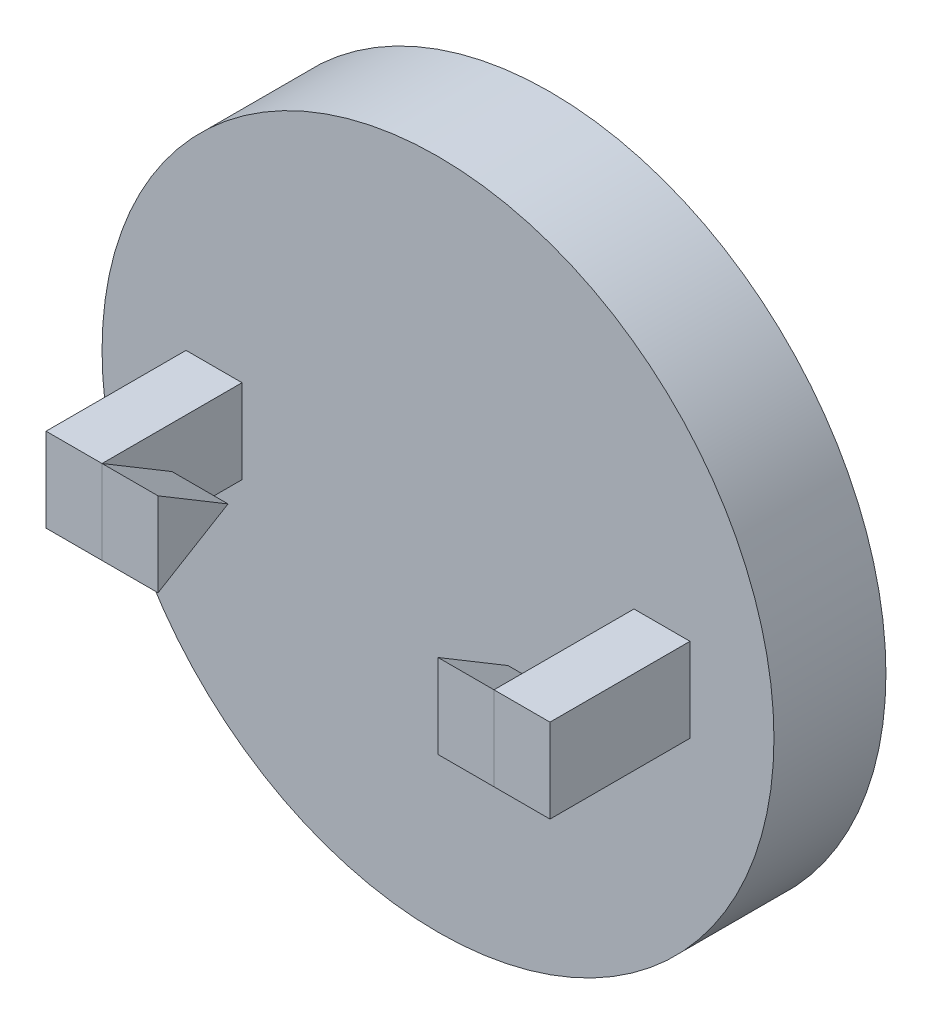
ISO-10303-21;
HEADER;
FILE_DESCRIPTION(('STEP AP214'),'2;1');
FILE_NAME('part.step','',(''),(''),'','','');
FILE_SCHEMA(('AUTOMOTIVE_DESIGN { 1 0 10303 214 1 1 1 1 }'));
ENDSEC;
DATA;
#1=APPLICATION_CONTEXT('core data for automotive mechanical design processes');
#2=APPLICATION_PROTOCOL_DEFINITION('international standard','automotive_design',2000,#1);
#3=PRODUCT_CONTEXT('',#1,'mechanical');
#4=PRODUCT('Part','Part','',(#3));
#5=PRODUCT_RELATED_PRODUCT_CATEGORY('part','',(#4));
#6=PRODUCT_DEFINITION_FORMATION('','',#4);
#7=PRODUCT_DEFINITION_CONTEXT('part definition',#1,'design');
#8=PRODUCT_DEFINITION('design','',#6,#7);
#9=PRODUCT_DEFINITION_SHAPE('','',#8);
#10=(LENGTH_UNIT() NAMED_UNIT(*) SI_UNIT(.MILLI.,.METRE.));
#11=(NAMED_UNIT(*) PLANE_ANGLE_UNIT() SI_UNIT($,.RADIAN.));
#12=(NAMED_UNIT(*) SI_UNIT($,.STERADIAN.) SOLID_ANGLE_UNIT());
#13=UNCERTAINTY_MEASURE_WITH_UNIT(LENGTH_MEASURE(1.E-05),#10,'distance_accuracy_value','');
#14=(GEOMETRIC_REPRESENTATION_CONTEXT(3) GLOBAL_UNCERTAINTY_ASSIGNED_CONTEXT((#13)) GLOBAL_UNIT_ASSIGNED_CONTEXT((#10,
#11,#12)) REPRESENTATION_CONTEXT('',''));
#15=CARTESIAN_POINT('',(0.,0.,0.));
#16=DIRECTION('',(0.,0.,1.));
#17=DIRECTION('',(1.,0.,0.));
#18=AXIS2_PLACEMENT_3D('',#15,#16,#17);
#19=CARTESIAN_POINT('',(35.,7.5,35.));
#20=DIRECTION('',(1.,0.,0.));
#21=DIRECTION('',(0.,0.,1.));
#22=AXIS2_PLACEMENT_3D('',#19,#20,#21);
#23=PLANE('',#22);
#24=DIRECTION('',(0.,1.,0.));
#25=VECTOR('',#24,1.);
#26=CARTESIAN_POINT('',(35.,7.5,10.));
#27=LINE('',#26,#25);
#28=CARTESIAN_POINT('',(35.,-7.5,10.));
#29=VERTEX_POINT('',#28);
#30=CARTESIAN_POINT('',(35.,7.5,10.));
#31=VERTEX_POINT('',#30);
#32=EDGE_CURVE('E117',#29,#31,#27,.T.);
#33=ORIENTED_EDGE('',*,*,#32,.F.);
#34=DIRECTION('',(0.,0.,-1.));
#35=VECTOR('',#34,1.);
#36=CARTESIAN_POINT('',(35.,-7.5,35.));
#37=LINE('',#36,#35);
#38=CARTESIAN_POINT('',(35.,-7.5,35.));
#39=VERTEX_POINT('',#38);
#40=EDGE_CURVE('E116',#39,#29,#37,.T.);
#41=ORIENTED_EDGE('',*,*,#40,.F.);
#42=DIRECTION('',(0.,1.,0.));
#43=VECTOR('',#42,1.);
#44=CARTESIAN_POINT('',(35.,7.5,35.));
#45=LINE('',#44,#43);
#46=CARTESIAN_POINT('',(35.,7.5,35.));
#47=VERTEX_POINT('',#46);
#48=EDGE_CURVE('E111',#39,#47,#45,.T.);
#49=ORIENTED_EDGE('',*,*,#48,.T.);
#50=DIRECTION('',(0.,0.,-1.));
#51=VECTOR('',#50,1.);
#52=CARTESIAN_POINT('',(35.,7.5,35.));
#53=LINE('',#52,#51);
#54=EDGE_CURVE('E12',#47,#31,#53,.T.);
#55=ORIENTED_EDGE('',*,*,#54,.T.);
#56=EDGE_LOOP('',(#33,#41,#49,#55));
#57=FACE_BOUND('',#56,.T.);
#58=ADVANCED_FACE('F54',(#57),#23,.F.);
#59=CARTESIAN_POINT('',(45.,7.5,35.));
#60=DIRECTION('',(0.,-1.,0.));
#61=DIRECTION('',(0.,0.,-1.));
#62=AXIS2_PLACEMENT_3D('',#59,#60,#61);
#63=PLANE('',#62);
#64=DIRECTION('',(1.,0.,0.));
#65=VECTOR('',#64,1.);
#66=CARTESIAN_POINT('',(45.,7.5,10.));
#67=LINE('',#66,#65);
#68=CARTESIAN_POINT('',(45.,7.5,10.));
#69=VERTEX_POINT('',#68);
#70=EDGE_CURVE('E119',#31,#69,#67,.T.);
#71=ORIENTED_EDGE('',*,*,#70,.F.);
#72=ORIENTED_EDGE('',*,*,#54,.F.);
#73=DIRECTION('',(1.,0.,0.));
#74=VECTOR('',#73,1.);
#75=CARTESIAN_POINT('',(45.,7.5,35.));
#76=LINE('',#75,#74);
#77=CARTESIAN_POINT('',(45.,7.5,35.));
#78=VERTEX_POINT('',#77);
#79=EDGE_CURVE('E95',#47,#78,#76,.T.);
#80=ORIENTED_EDGE('',*,*,#79,.T.);
#81=DIRECTION('',(0.,0.,-1.));
#82=VECTOR('',#81,1.);
#83=CARTESIAN_POINT('',(45.,7.5,35.));
#84=LINE('',#83,#82);
#85=EDGE_CURVE('E62',#78,#69,#84,.T.);
#86=ORIENTED_EDGE('',*,*,#85,.T.);
#87=EDGE_LOOP('',(#71,#72,#80,#86));
#88=FACE_BOUND('',#87,.T.);
#89=ADVANCED_FACE('F109',(#88),#63,.F.);
#90=CARTESIAN_POINT('',(45.,7.5,35.));
#91=DIRECTION('',(-1.,0.,0.));
#92=DIRECTION('',(0.,0.,-1.));
#93=AXIS2_PLACEMENT_3D('',#90,#91,#92);
#94=PLANE('',#93);
#95=DIRECTION('',(0.,-1.,0.));
#96=VECTOR('',#95,1.);
#97=CARTESIAN_POINT('',(45.,7.5,10.));
#98=LINE('',#97,#96);
#99=CARTESIAN_POINT('',(45.,-7.5,10.));
#100=VERTEX_POINT('',#99);
#101=EDGE_CURVE('E105',#69,#100,#98,.T.);
#102=ORIENTED_EDGE('',*,*,#101,.F.);
#103=ORIENTED_EDGE('',*,*,#85,.F.);
#104=DIRECTION('',(0.,-1.,0.));
#105=VECTOR('',#104,1.);
#106=CARTESIAN_POINT('',(45.,7.5,35.));
#107=LINE('',#106,#105);
#108=CARTESIAN_POINT('',(45.,-7.5,35.));
#109=VERTEX_POINT('',#108);
#110=EDGE_CURVE('E98',#78,#109,#107,.T.);
#111=ORIENTED_EDGE('',*,*,#110,.T.);
#112=DIRECTION('',(0.,0.,-1.));
#113=VECTOR('',#112,1.);
#114=CARTESIAN_POINT('',(45.,-7.5,35.));
#115=LINE('',#114,#113);
#116=EDGE_CURVE('E108',#109,#100,#115,.T.);
#117=ORIENTED_EDGE('',*,*,#116,.T.);
#118=EDGE_LOOP('',(#102,#103,#111,#117));
#119=FACE_BOUND('',#118,.T.);
#120=ADVANCED_FACE('F104',(#119),#94,.F.);
#121=CARTESIAN_POINT('',(45.,-7.5,35.));
#122=DIRECTION('',(0.,1.,0.));
#123=DIRECTION('',(1.,0.,0.));
#124=AXIS2_PLACEMENT_3D('',#121,#122,#123);
#125=PLANE('',#124);
#126=DIRECTION('',(-1.,0.,0.));
#127=VECTOR('',#126,1.);
#128=CARTESIAN_POINT('',(45.,-7.5,10.));
#129=LINE('',#128,#127);
#130=EDGE_CURVE('E84',#100,#29,#129,.T.);
#131=ORIENTED_EDGE('',*,*,#130,.F.);
#132=ORIENTED_EDGE('',*,*,#116,.F.);
#133=DIRECTION('',(-1.,0.,0.));
#134=VECTOR('',#133,1.);
#135=CARTESIAN_POINT('',(45.,-7.5,35.));
#136=LINE('',#135,#134);
#137=EDGE_CURVE('E70',#109,#39,#136,.T.);
#138=ORIENTED_EDGE('',*,*,#137,.T.);
#139=ORIENTED_EDGE('',*,*,#40,.T.);
#140=EDGE_LOOP('',(#131,#132,#138,#139));
#141=FACE_BOUND('',#140,.T.);
#142=ADVANCED_FACE('F128',(#141),#125,.F.);
#143=CARTESIAN_POINT('',(0.,0.,35.));
#144=DIRECTION('',(0.,0.,1.));
#145=DIRECTION('',(-1.,0.,0.));
#146=AXIS2_PLACEMENT_3D('',#143,#144,#145);
#147=PLANE('',#146);
#148=ORIENTED_EDGE('',*,*,#48,.F.);
#149=ORIENTED_EDGE('',*,*,#137,.F.);
#150=ORIENTED_EDGE('',*,*,#110,.F.);
#151=ORIENTED_EDGE('',*,*,#79,.F.);
#152=EDGE_LOOP('',(#148,#149,#150,#151));
#153=FACE_BOUND('',#152,.T.);
#154=ADVANCED_FACE('F100',(#153),#147,.T.);
#155=CARTESIAN_POINT('',(0.,0.,10.));
#156=DIRECTION('',(0.,0.,1.));
#157=DIRECTION('',(-1.,0.,0.));
#158=AXIS2_PLACEMENT_3D('',#155,#156,#157);
#159=PLANE('',#158);
#160=ORIENTED_EDGE('',*,*,#32,.T.);
#161=ORIENTED_EDGE('',*,*,#70,.T.);
#162=ORIENTED_EDGE('',*,*,#101,.T.);
#163=ORIENTED_EDGE('',*,*,#130,.T.);
#164=EDGE_LOOP('',(#160,#161,#162,#163));
#165=FACE_BOUND('',#164,.T.);
#166=ADVANCED_FACE('F124',(#165),#159,.F.);
#167=CLOSED_SHELL('',(#58,#89,#120,#142,#154,#166));
#168=MANIFOLD_SOLID_BREP('B2',#167);
#169=CARTESIAN_POINT('',(25.,-9.9264705882353,5.95588235294118));
#170=DIRECTION('',(0.,0.857492925712544,-0.514495755427526));
#171=DIRECTION('',(0.,0.514495755427527,0.857492925712544));
#172=AXIS2_PLACEMENT_3D('',#169,#170,#171);
#173=PLANE('',#172);
#174=DIRECTION('',(0.,-0.514495755427527,-0.857492925712544));
#175=VECTOR('',#174,1.);
#176=CARTESIAN_POINT('',(35.,-9.9264705882353,5.95588235294118));
#177=LINE('',#176,#175);
#178=CARTESIAN_POINT('',(35.,7.5,35.));
#179=VERTEX_POINT('',#178);
#180=CARTESIAN_POINT('',(35.,0.,22.5));
#181=VERTEX_POINT('',#180);
#182=EDGE_CURVE('E252',#179,#181,#177,.T.);
#183=ORIENTED_EDGE('',*,*,#182,.T.);
#184=DIRECTION('',(1.,0.,0.));
#185=VECTOR('',#184,1.);
#186=CARTESIAN_POINT('',(25.,0.,22.5));
#187=LINE('',#186,#185);
#188=CARTESIAN_POINT('',(25.,0.,22.5));
#189=VERTEX_POINT('',#188);
#190=EDGE_CURVE('E247',#189,#181,#187,.T.);
#191=ORIENTED_EDGE('',*,*,#190,.F.);
#192=DIRECTION('',(0.,-0.514495755427527,-0.857492925712544));
#193=VECTOR('',#192,1.);
#194=CARTESIAN_POINT('',(25.,-9.9264705882353,5.95588235294118));
#195=LINE('',#194,#193);
#196=CARTESIAN_POINT('',(25.,7.5,35.));
#197=VERTEX_POINT('',#196);
#198=EDGE_CURVE('E239',#197,#189,#195,.T.);
#199=ORIENTED_EDGE('',*,*,#198,.F.);
#200=DIRECTION('',(1.,0.,0.));
#201=VECTOR('',#200,1.);
#202=CARTESIAN_POINT('',(25.,7.5,35.));
#203=LINE('',#202,#201);
#204=EDGE_CURVE('E52',#197,#179,#203,.T.);
#205=ORIENTED_EDGE('',*,*,#204,.T.);
#206=EDGE_LOOP('',(#183,#191,#199,#205));
#207=FACE_BOUND('',#206,.T.);
#208=ADVANCED_FACE('F200',(#207),#173,.T.);
#209=CARTESIAN_POINT('',(25.,0.,35.));
#210=DIRECTION('',(0.,0.,-1.));
#211=DIRECTION('',(1.,0.,0.));
#212=AXIS2_PLACEMENT_3D('',#209,#210,#211);
#213=PLANE('',#212);
#214=DIRECTION('',(0.,-1.,0.));
#215=VECTOR('',#214,1.);
#216=CARTESIAN_POINT('',(35.,0.,35.));
#217=LINE('',#216,#215);
#218=CARTESIAN_POINT('',(35.,-7.5,35.));
#219=VERTEX_POINT('',#218);
#220=EDGE_CURVE('E244',#179,#219,#217,.T.);
#221=ORIENTED_EDGE('',*,*,#220,.F.);
#222=ORIENTED_EDGE('',*,*,#204,.F.);
#223=DIRECTION('',(0.,-1.,0.));
#224=VECTOR('',#223,1.);
#225=CARTESIAN_POINT('',(25.,0.,35.));
#226=LINE('',#225,#224);
#227=CARTESIAN_POINT('',(25.,-7.5,35.));
#228=VERTEX_POINT('',#227);
#229=EDGE_CURVE('E235',#197,#228,#226,.T.);
#230=ORIENTED_EDGE('',*,*,#229,.T.);
#231=DIRECTION('',(1.,0.,0.));
#232=VECTOR('',#231,1.);
#233=CARTESIAN_POINT('',(25.,-7.5,35.));
#234=LINE('',#233,#232);
#235=EDGE_CURVE('E208',#228,#219,#234,.T.);
#236=ORIENTED_EDGE('',*,*,#235,.T.);
#237=EDGE_LOOP('',(#221,#222,#230,#236));
#238=FACE_BOUND('',#237,.T.);
#239=ADVANCED_FACE('F243',(#238),#213,.F.);
#240=CARTESIAN_POINT('',(25.,9.9264705882353,5.95588235294118));
#241=DIRECTION('',(0.,0.857492925712544,0.514495755427526));
#242=DIRECTION('',(0.,-0.514495755427527,0.857492925712544));
#243=AXIS2_PLACEMENT_3D('',#240,#241,#242);
#244=PLANE('',#243);
#245=DIRECTION('',(0.,0.514495755427527,-0.857492925712544));
#246=VECTOR('',#245,1.);
#247=CARTESIAN_POINT('',(35.,9.9264705882353,5.95588235294118));
#248=LINE('',#247,#246);
#249=EDGE_CURVE('E227',#219,#181,#248,.T.);
#250=ORIENTED_EDGE('',*,*,#249,.F.);
#251=ORIENTED_EDGE('',*,*,#235,.F.);
#252=DIRECTION('',(0.,0.514495755427527,-0.857492925712544));
#253=VECTOR('',#252,1.);
#254=CARTESIAN_POINT('',(25.,9.9264705882353,5.95588235294118));
#255=LINE('',#254,#253);
#256=EDGE_CURVE('E216',#228,#189,#255,.T.);
#257=ORIENTED_EDGE('',*,*,#256,.T.);
#258=ORIENTED_EDGE('',*,*,#190,.T.);
#259=EDGE_LOOP('',(#250,#251,#257,#258));
#260=FACE_BOUND('',#259,.T.);
#261=ADVANCED_FACE('F261',(#260),#244,.F.);
#262=CARTESIAN_POINT('',(25.,0.,0.));
#263=DIRECTION('',(-1.,0.,0.));
#264=DIRECTION('',(0.,0.,-1.));
#265=AXIS2_PLACEMENT_3D('',#262,#263,#264);
#266=PLANE('',#265);
#267=ORIENTED_EDGE('',*,*,#198,.T.);
#268=ORIENTED_EDGE('',*,*,#256,.F.);
#269=ORIENTED_EDGE('',*,*,#229,.F.);
#270=EDGE_LOOP('',(#267,#268,#269));
#271=FACE_BOUND('',#270,.T.);
#272=ADVANCED_FACE('F237',(#271),#266,.T.);
#273=CARTESIAN_POINT('',(35.,0.,0.));
#274=DIRECTION('',(-1.,0.,0.));
#275=DIRECTION('',(0.,0.,-1.));
#276=AXIS2_PLACEMENT_3D('',#273,#274,#275);
#277=PLANE('',#276);
#278=ORIENTED_EDGE('',*,*,#182,.F.);
#279=ORIENTED_EDGE('',*,*,#220,.T.);
#280=ORIENTED_EDGE('',*,*,#249,.T.);
#281=EDGE_LOOP('',(#278,#279,#280));
#282=FACE_BOUND('',#281,.T.);
#283=ADVANCED_FACE('F255',(#282),#277,.F.);
#284=CLOSED_SHELL('',(#208,#239,#261,#272,#283));
#285=MANIFOLD_SOLID_BREP('B6',#284);
#286=CARTESIAN_POINT('',(-25.,-9.9264705882353,5.95588235294118));
#287=DIRECTION('',(0.,0.857492925712544,-0.514495755427526));
#288=DIRECTION('',(0.,0.514495755427527,0.857492925712544));
#289=AXIS2_PLACEMENT_3D('',#286,#287,#288);
#290=PLANE('',#289);
#291=DIRECTION('',(0.,-0.514495755427527,-0.857492925712544));
#292=VECTOR('',#291,1.);
#293=CARTESIAN_POINT('',(-35.,-9.9264705882353,5.95588235294118));
#294=LINE('',#293,#292);
#295=CARTESIAN_POINT('',(-35.,7.5,35.));
#296=VERTEX_POINT('',#295);
#297=CARTESIAN_POINT('',(-35.,0.,22.5));
#298=VERTEX_POINT('',#297);
#299=EDGE_CURVE('E367',#296,#298,#294,.T.);
#300=ORIENTED_EDGE('',*,*,#299,.F.);
#301=DIRECTION('',(-1.,0.,0.));
#302=VECTOR('',#301,1.);
#303=CARTESIAN_POINT('',(-25.,7.5,35.));
#304=LINE('',#303,#302);
#305=CARTESIAN_POINT('',(-25.,7.5,35.));
#306=VERTEX_POINT('',#305);
#307=EDGE_CURVE('E198',#306,#296,#304,.T.);
#308=ORIENTED_EDGE('',*,*,#307,.F.);
#309=DIRECTION('',(0.,-0.514495755427527,-0.857492925712544));
#310=VECTOR('',#309,1.);
#311=CARTESIAN_POINT('',(-25.,-9.9264705882353,5.95588235294118));
#312=LINE('',#311,#310);
#313=CARTESIAN_POINT('',(-25.,0.,22.5));
#314=VERTEX_POINT('',#313);
#315=EDGE_CURVE('E365',#306,#314,#312,.T.);
#316=ORIENTED_EDGE('',*,*,#315,.T.);
#317=DIRECTION('',(-1.,0.,0.));
#318=VECTOR('',#317,1.);
#319=CARTESIAN_POINT('',(-25.,0.,22.5));
#320=LINE('',#319,#318);
#321=EDGE_CURVE('E361',#314,#298,#320,.T.);
#322=ORIENTED_EDGE('',*,*,#321,.T.);
#323=EDGE_LOOP('',(#300,#308,#316,#322));
#324=FACE_BOUND('',#323,.T.);
#325=ADVANCED_FACE('F327',(#324),#290,.T.);
#326=CARTESIAN_POINT('',(-25.,0.,35.));
#327=DIRECTION('',(0.,0.,-1.));
#328=DIRECTION('',(-1.,0.,0.));
#329=AXIS2_PLACEMENT_3D('',#326,#327,#328);
#330=PLANE('',#329);
#331=DIRECTION('',(0.,-1.,0.));
#332=VECTOR('',#331,1.);
#333=CARTESIAN_POINT('',(-35.,0.,35.));
#334=LINE('',#333,#332);
#335=CARTESIAN_POINT('',(-35.,-7.5,35.));
#336=VERTEX_POINT('',#335);
#337=EDGE_CURVE('E355',#296,#336,#334,.T.);
#338=ORIENTED_EDGE('',*,*,#337,.T.);
#339=DIRECTION('',(-1.,0.,0.));
#340=VECTOR('',#339,1.);
#341=CARTESIAN_POINT('',(-25.,-7.5,35.));
#342=LINE('',#341,#340);
#343=CARTESIAN_POINT('',(-25.,-7.5,35.));
#344=VERTEX_POINT('',#343);
#345=EDGE_CURVE('E335',#344,#336,#342,.T.);
#346=ORIENTED_EDGE('',*,*,#345,.F.);
#347=DIRECTION('',(0.,-1.,0.));
#348=VECTOR('',#347,1.);
#349=CARTESIAN_POINT('',(-25.,0.,35.));
#350=LINE('',#349,#348);
#351=EDGE_CURVE('E368',#306,#344,#350,.T.);
#352=ORIENTED_EDGE('',*,*,#351,.F.);
#353=ORIENTED_EDGE('',*,*,#307,.T.);
#354=EDGE_LOOP('',(#338,#346,#352,#353));
#355=FACE_BOUND('',#354,.T.);
#356=ADVANCED_FACE('F369',(#355),#330,.F.);
#357=CARTESIAN_POINT('',(-25.,9.9264705882353,5.95588235294118));
#358=DIRECTION('',(0.,0.857492925712544,0.514495755427526));
#359=DIRECTION('',(0.,-0.514495755427527,0.857492925712544));
#360=AXIS2_PLACEMENT_3D('',#357,#358,#359);
#361=PLANE('',#360);
#362=DIRECTION('',(0.,0.514495755427527,-0.857492925712544));
#363=VECTOR('',#362,1.);
#364=CARTESIAN_POINT('',(-35.,9.9264705882353,5.95588235294118));
#365=LINE('',#364,#363);
#366=EDGE_CURVE('E372',#336,#298,#365,.T.);
#367=ORIENTED_EDGE('',*,*,#366,.T.);
#368=ORIENTED_EDGE('',*,*,#321,.F.);
#369=DIRECTION('',(0.,0.514495755427527,-0.857492925712544));
#370=VECTOR('',#369,1.);
#371=CARTESIAN_POINT('',(-25.,9.9264705882353,5.95588235294118));
#372=LINE('',#371,#370);
#373=EDGE_CURVE('E343',#344,#314,#372,.T.);
#374=ORIENTED_EDGE('',*,*,#373,.F.);
#375=ORIENTED_EDGE('',*,*,#345,.T.);
#376=EDGE_LOOP('',(#367,#368,#374,#375));
#377=FACE_BOUND('',#376,.T.);
#378=ADVANCED_FACE('F381',(#377),#361,.F.);
#379=CARTESIAN_POINT('',(-25.,0.,0.));
#380=DIRECTION('',(1.,0.,0.));
#381=DIRECTION('',(0.,0.,-1.));
#382=AXIS2_PLACEMENT_3D('',#379,#380,#381);
#383=PLANE('',#382);
#384=ORIENTED_EDGE('',*,*,#315,.F.);
#385=ORIENTED_EDGE('',*,*,#351,.T.);
#386=ORIENTED_EDGE('',*,*,#373,.T.);
#387=EDGE_LOOP('',(#384,#385,#386));
#388=FACE_BOUND('',#387,.T.);
#389=ADVANCED_FACE('F371',(#388),#383,.T.);
#390=CARTESIAN_POINT('',(-35.,0.,0.));
#391=DIRECTION('',(1.,0.,0.));
#392=DIRECTION('',(0.,0.,-1.));
#393=AXIS2_PLACEMENT_3D('',#390,#391,#392);
#394=PLANE('',#393);
#395=ORIENTED_EDGE('',*,*,#299,.T.);
#396=ORIENTED_EDGE('',*,*,#366,.F.);
#397=ORIENTED_EDGE('',*,*,#337,.F.);
#398=EDGE_LOOP('',(#395,#396,#397));
#399=FACE_BOUND('',#398,.T.);
#400=ADVANCED_FACE('F383',(#399),#394,.F.);
#401=CLOSED_SHELL('',(#325,#356,#378,#389,#400));
#402=MANIFOLD_SOLID_BREP('B46',#401);
#403=CARTESIAN_POINT('',(-35.,7.5,35.));
#404=DIRECTION('',(-1.,0.,0.));
#405=DIRECTION('',(0.,0.,1.));
#406=AXIS2_PLACEMENT_3D('',#403,#404,#405);
#407=PLANE('',#406);
#408=DIRECTION('',(0.,1.,0.));
#409=VECTOR('',#408,1.);
#410=CARTESIAN_POINT('',(-35.,7.5,10.));
#411=LINE('',#410,#409);
#412=CARTESIAN_POINT('',(-35.,-7.5,10.));
#413=VERTEX_POINT('',#412);
#414=CARTESIAN_POINT('',(-35.,7.5,10.));
#415=VERTEX_POINT('',#414);
#416=EDGE_CURVE('E530',#413,#415,#411,.T.);
#417=ORIENTED_EDGE('',*,*,#416,.T.);
#418=DIRECTION('',(0.,0.,-1.));
#419=VECTOR('',#418,1.);
#420=CARTESIAN_POINT('',(-35.,7.5,35.));
#421=LINE('',#420,#419);
#422=CARTESIAN_POINT('',(-35.,7.5,35.));
#423=VERTEX_POINT('',#422);
#424=EDGE_CURVE('E325',#423,#415,#421,.T.);
#425=ORIENTED_EDGE('',*,*,#424,.F.);
#426=DIRECTION('',(0.,1.,0.));
#427=VECTOR('',#426,1.);
#428=CARTESIAN_POINT('',(-35.,7.5,35.));
#429=LINE('',#428,#427);
#430=CARTESIAN_POINT('',(-35.,-7.5,35.));
#431=VERTEX_POINT('',#430);
#432=EDGE_CURVE('E518',#431,#423,#429,.T.);
#433=ORIENTED_EDGE('',*,*,#432,.F.);
#434=DIRECTION('',(0.,0.,-1.));
#435=VECTOR('',#434,1.);
#436=CARTESIAN_POINT('',(-35.,-7.5,35.));
#437=LINE('',#436,#435);
#438=EDGE_CURVE('E526',#431,#413,#437,.T.);
#439=ORIENTED_EDGE('',*,*,#438,.T.);
#440=EDGE_LOOP('',(#417,#425,#433,#439));
#441=FACE_BOUND('',#440,.T.);
#442=ADVANCED_FACE('F467',(#441),#407,.F.);
#443=CARTESIAN_POINT('',(-45.,7.5,35.));
#444=DIRECTION('',(0.,-1.,0.));
#445=DIRECTION('',(0.,0.,-1.));
#446=AXIS2_PLACEMENT_3D('',#443,#444,#445);
#447=PLANE('',#446);
#448=DIRECTION('',(-1.,0.,0.));
#449=VECTOR('',#448,1.);
#450=CARTESIAN_POINT('',(-45.,7.5,10.));
#451=LINE('',#450,#449);
#452=CARTESIAN_POINT('',(-45.,7.5,10.));
#453=VERTEX_POINT('',#452);
#454=EDGE_CURVE('E522',#415,#453,#451,.T.);
#455=ORIENTED_EDGE('',*,*,#454,.T.);
#456=DIRECTION('',(0.,0.,-1.));
#457=VECTOR('',#456,1.);
#458=CARTESIAN_POINT('',(-45.,7.5,35.));
#459=LINE('',#458,#457);
#460=CARTESIAN_POINT('',(-45.,7.5,35.));
#461=VERTEX_POINT('',#460);
#462=EDGE_CURVE('E475',#461,#453,#459,.T.);
#463=ORIENTED_EDGE('',*,*,#462,.F.);
#464=DIRECTION('',(-1.,0.,0.));
#465=VECTOR('',#464,1.);
#466=CARTESIAN_POINT('',(-45.,7.5,35.));
#467=LINE('',#466,#465);
#468=EDGE_CURVE('E513',#423,#461,#467,.T.);
#469=ORIENTED_EDGE('',*,*,#468,.F.);
#470=ORIENTED_EDGE('',*,*,#424,.T.);
#471=EDGE_LOOP('',(#455,#463,#469,#470));
#472=FACE_BOUND('',#471,.T.);
#473=ADVANCED_FACE('F521',(#472),#447,.F.);
#474=CARTESIAN_POINT('',(-45.,7.5,35.));
#475=DIRECTION('',(1.,0.,0.));
#476=DIRECTION('',(0.,0.,-1.));
#477=AXIS2_PLACEMENT_3D('',#474,#475,#476);
#478=PLANE('',#477);
#479=DIRECTION('',(0.,-1.,0.));
#480=VECTOR('',#479,1.);
#481=CARTESIAN_POINT('',(-45.,7.5,10.));
#482=LINE('',#481,#480);
#483=CARTESIAN_POINT('',(-45.,-7.5,10.));
#484=VERTEX_POINT('',#483);
#485=EDGE_CURVE('E500',#453,#484,#482,.T.);
#486=ORIENTED_EDGE('',*,*,#485,.T.);
#487=DIRECTION('',(0.,0.,-1.));
#488=VECTOR('',#487,1.);
#489=CARTESIAN_POINT('',(-45.,-7.5,35.));
#490=LINE('',#489,#488);
#491=CARTESIAN_POINT('',(-45.,-7.5,35.));
#492=VERTEX_POINT('',#491);
#493=EDGE_CURVE('E523',#492,#484,#490,.T.);
#494=ORIENTED_EDGE('',*,*,#493,.F.);
#495=DIRECTION('',(0.,-1.,0.));
#496=VECTOR('',#495,1.);
#497=CARTESIAN_POINT('',(-45.,7.5,35.));
#498=LINE('',#497,#496);
#499=EDGE_CURVE('E516',#461,#492,#498,.T.);
#500=ORIENTED_EDGE('',*,*,#499,.F.);
#501=ORIENTED_EDGE('',*,*,#462,.T.);
#502=EDGE_LOOP('',(#486,#494,#500,#501));
#503=FACE_BOUND('',#502,.T.);
#504=ADVANCED_FACE('F524',(#503),#478,.F.);
#505=CARTESIAN_POINT('',(-45.,-7.5,35.));
#506=DIRECTION('',(0.,1.,0.));
#507=DIRECTION('',(-1.,0.,0.));
#508=AXIS2_PLACEMENT_3D('',#505,#506,#507);
#509=PLANE('',#508);
#510=DIRECTION('',(1.,0.,0.));
#511=VECTOR('',#510,1.);
#512=CARTESIAN_POINT('',(-45.,-7.5,10.));
#513=LINE('',#512,#511);
#514=EDGE_CURVE('E506',#484,#413,#513,.T.);
#515=ORIENTED_EDGE('',*,*,#514,.T.);
#516=ORIENTED_EDGE('',*,*,#438,.F.);
#517=DIRECTION('',(1.,0.,0.));
#518=VECTOR('',#517,1.);
#519=CARTESIAN_POINT('',(-45.,-7.5,35.));
#520=LINE('',#519,#518);
#521=EDGE_CURVE('E483',#492,#431,#520,.T.);
#522=ORIENTED_EDGE('',*,*,#521,.F.);
#523=ORIENTED_EDGE('',*,*,#493,.T.);
#524=EDGE_LOOP('',(#515,#516,#522,#523));
#525=FACE_BOUND('',#524,.T.);
#526=ADVANCED_FACE('F537',(#525),#509,.F.);
#527=CARTESIAN_POINT('',(0.,0.,35.));
#528=DIRECTION('',(0.,0.,1.));
#529=DIRECTION('',(1.,0.,0.));
#530=AXIS2_PLACEMENT_3D('',#527,#528,#529);
#531=PLANE('',#530);
#532=ORIENTED_EDGE('',*,*,#432,.T.);
#533=ORIENTED_EDGE('',*,*,#468,.T.);
#534=ORIENTED_EDGE('',*,*,#499,.T.);
#535=ORIENTED_EDGE('',*,*,#521,.T.);
#536=EDGE_LOOP('',(#532,#533,#534,#535));
#537=FACE_BOUND('',#536,.T.);
#538=ADVANCED_FACE('F514',(#537),#531,.T.);
#539=CARTESIAN_POINT('',(0.,0.,10.));
#540=DIRECTION('',(0.,0.,1.));
#541=DIRECTION('',(1.,0.,0.));
#542=AXIS2_PLACEMENT_3D('',#539,#540,#541);
#543=PLANE('',#542);
#544=ORIENTED_EDGE('',*,*,#416,.F.);
#545=ORIENTED_EDGE('',*,*,#514,.F.);
#546=ORIENTED_EDGE('',*,*,#485,.F.);
#547=ORIENTED_EDGE('',*,*,#454,.F.);
#548=EDGE_LOOP('',(#544,#545,#546,#547));
#549=FACE_BOUND('',#548,.T.);
#550=ADVANCED_FACE('F540',(#549),#543,.F.);
#551=CLOSED_SHELL('',(#442,#473,#504,#526,#538,#550));
#552=MANIFOLD_SOLID_BREP('B192',#551);
#553=CARTESIAN_POINT('',(0.,0.,10.));
#554=DIRECTION('',(0.,0.,-1.));
#555=DIRECTION('',(-1.,0.,0.));
#556=AXIS2_PLACEMENT_3D('',#553,#554,#555);
#557=CYLINDRICAL_SURFACE('',#556,60.);
#558=CARTESIAN_POINT('',(0.,0.,10.));
#559=DIRECTION('',(0.,0.,1.));
#560=DIRECTION('',(1.,0.,0.));
#561=AXIS2_PLACEMENT_3D('',#558,#559,#560);
#562=CIRCLE('',#561,60.);
#563=CARTESIAN_POINT('',(60.,0.,10.));
#564=VERTEX_POINT('',#563);
#565=EDGE_CURVE('E466',#564,#564,#562,.T.);
#566=ORIENTED_EDGE('',*,*,#565,.F.);
#567=EDGE_LOOP('',(#566));
#568=FACE_BOUND('',#567,.T.);
#569=CARTESIAN_POINT('',(0.,0.,-10.));
#570=DIRECTION('',(0.,0.,1.));
#571=DIRECTION('',(1.,0.,0.));
#572=AXIS2_PLACEMENT_3D('',#569,#570,#571);
#573=CIRCLE('',#572,60.);
#574=CARTESIAN_POINT('',(60.,0.,-10.));
#575=VERTEX_POINT('',#574);
#576=EDGE_CURVE('E606',#575,#575,#573,.T.);
#577=ORIENTED_EDGE('',*,*,#576,.T.);
#578=EDGE_LOOP('',(#577));
#579=FACE_BOUND('',#578,.T.);
#580=ADVANCED_FACE('F603',(#568,#579),#557,.T.);
#581=CARTESIAN_POINT('',(0.,0.,10.));
#582=DIRECTION('',(0.,0.,1.));
#583=DIRECTION('',(1.,0.,0.));
#584=AXIS2_PLACEMENT_3D('',#581,#582,#583);
#585=PLANE('',#584);
#586=ORIENTED_EDGE('',*,*,#565,.T.);
#587=EDGE_LOOP('',(#586));
#588=FACE_BOUND('',#587,.T.);
#589=ADVANCED_FACE('F618',(#588),#585,.T.);
#590=CARTESIAN_POINT('',(0.,0.,-10.));
#591=DIRECTION('',(0.,0.,1.));
#592=DIRECTION('',(1.,0.,0.));
#593=AXIS2_PLACEMENT_3D('',#590,#591,#592);
#594=PLANE('',#593);
#595=ORIENTED_EDGE('',*,*,#576,.F.);
#596=EDGE_LOOP('',(#595));
#597=FACE_BOUND('',#596,.T.);
#598=ADVANCED_FACE('F616',(#597),#594,.F.);
#599=CLOSED_SHELL('',(#580,#589,#598));
#600=MANIFOLD_SOLID_BREP('B319',#599);
#601=ADVANCED_BREP_SHAPE_REPRESENTATION('',(#18,#168,#285,#402,#552,#600),#14);
#602=SHAPE_DEFINITION_REPRESENTATION(#9,#601);
ENDSEC;
END-ISO-10303-21;
